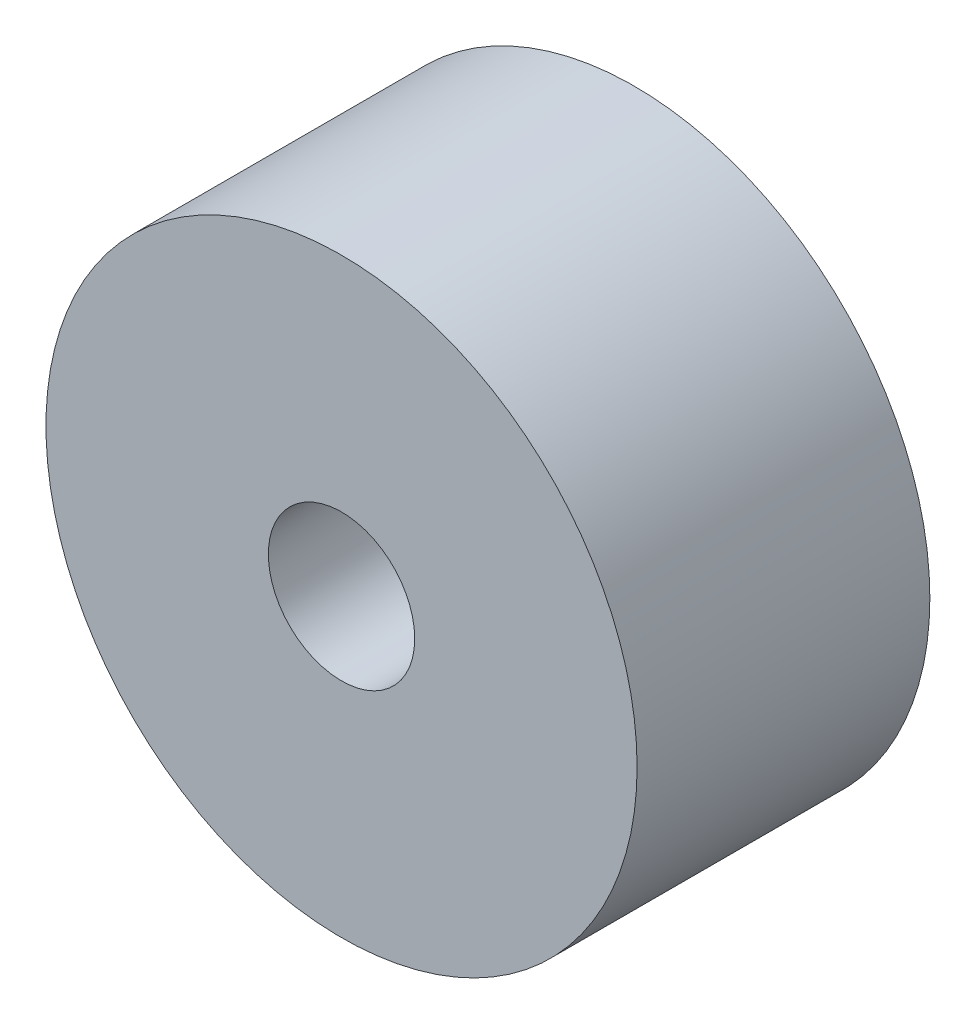
ISO-10303-21;
HEADER;
FILE_DESCRIPTION(('STEP AP214'),'2;1');
FILE_NAME('part.step','',(''),(''),'','','');
FILE_SCHEMA(('AUTOMOTIVE_DESIGN { 1 0 10303 214 1 1 1 1 }'));
ENDSEC;
DATA;
#1=APPLICATION_CONTEXT('core data for automotive mechanical design processes');
#2=APPLICATION_PROTOCOL_DEFINITION('international standard','automotive_design',2000,#1);
#3=PRODUCT_CONTEXT('',#1,'mechanical');
#4=PRODUCT('Part','Part','',(#3));
#5=PRODUCT_RELATED_PRODUCT_CATEGORY('part','',(#4));
#6=PRODUCT_DEFINITION_FORMATION('','',#4);
#7=PRODUCT_DEFINITION_CONTEXT('part definition',#1,'design');
#8=PRODUCT_DEFINITION('design','',#6,#7);
#9=PRODUCT_DEFINITION_SHAPE('','',#8);
#10=(LENGTH_UNIT() NAMED_UNIT(*) SI_UNIT(.MILLI.,.METRE.));
#11=(NAMED_UNIT(*) PLANE_ANGLE_UNIT() SI_UNIT($,.RADIAN.));
#12=(NAMED_UNIT(*) SI_UNIT($,.STERADIAN.) SOLID_ANGLE_UNIT());
#13=UNCERTAINTY_MEASURE_WITH_UNIT(LENGTH_MEASURE(1.E-05),#10,'distance_accuracy_value','');
#14=(GEOMETRIC_REPRESENTATION_CONTEXT(3) GLOBAL_UNCERTAINTY_ASSIGNED_CONTEXT((#13)) GLOBAL_UNIT_ASSIGNED_CONTEXT((#10,
#11,#12)) REPRESENTATION_CONTEXT('',''));
#15=CARTESIAN_POINT('',(0.,0.,0.));
#16=DIRECTION('',(0.,0.,1.));
#17=DIRECTION('',(1.,0.,0.));
#18=AXIS2_PLACEMENT_3D('',#15,#16,#17);
#19=CARTESIAN_POINT('',(0.,0.,20.));
#20=DIRECTION('',(0.,0.,1.));
#21=DIRECTION('',(1.,0.,0.));
#22=AXIS2_PLACEMENT_3D('',#19,#20,#21);
#23=PLANE('',#22);
#24=CARTESIAN_POINT('',(0.,0.,20.));
#25=DIRECTION('',(0.,0.,1.));
#26=DIRECTION('',(1.,0.,0.));
#27=AXIS2_PLACEMENT_3D('',#24,#25,#26);
#28=CIRCLE('',#27,40.3846153846154);
#29=CARTESIAN_POINT('',(40.3846153846154,0.,20.));
#30=VERTEX_POINT('',#29);
#31=EDGE_CURVE('E10',#30,#30,#28,.T.);
#32=ORIENTED_EDGE('',*,*,#31,.T.);
#33=EDGE_LOOP('',(#32));
#34=FACE_BOUND('',#33,.T.);
#35=CARTESIAN_POINT('',(0.,0.,20.));
#36=DIRECTION('',(0.,0.,1.));
#37=DIRECTION('',(1.,0.,0.));
#38=AXIS2_PLACEMENT_3D('',#35,#36,#37);
#39=CIRCLE('',#38,10.);
#40=CARTESIAN_POINT('',(10.,0.,20.));
#41=VERTEX_POINT('',#40);
#42=EDGE_CURVE('E46',#41,#41,#39,.T.);
#43=ORIENTED_EDGE('',*,*,#42,.F.);
#44=EDGE_LOOP('',(#43));
#45=FACE_BOUND('',#44,.T.);
#46=ADVANCED_FACE('F35',(#34,#45),#23,.T.);
#47=CARTESIAN_POINT('',(0.,0.,-20.));
#48=DIRECTION('',(0.,0.,1.));
#49=DIRECTION('',(1.,0.,0.));
#50=AXIS2_PLACEMENT_3D('',#47,#48,#49);
#51=PLANE('',#50);
#52=CARTESIAN_POINT('',(0.,0.,-20.));
#53=DIRECTION('',(0.,0.,1.));
#54=DIRECTION('',(1.,0.,0.));
#55=AXIS2_PLACEMENT_3D('',#52,#53,#54);
#56=CIRCLE('',#55,40.3846153846154);
#57=CARTESIAN_POINT('',(40.3846153846154,0.,-20.));
#58=VERTEX_POINT('',#57);
#59=EDGE_CURVE('E39',#58,#58,#56,.T.);
#60=ORIENTED_EDGE('',*,*,#59,.F.);
#61=EDGE_LOOP('',(#60));
#62=FACE_BOUND('',#61,.T.);
#63=CARTESIAN_POINT('',(0.,0.,-20.));
#64=DIRECTION('',(0.,0.,1.));
#65=DIRECTION('',(1.,0.,0.));
#66=AXIS2_PLACEMENT_3D('',#63,#64,#65);
#67=CIRCLE('',#66,10.);
#68=CARTESIAN_POINT('',(10.,0.,-20.));
#69=VERTEX_POINT('',#68);
#70=EDGE_CURVE('E48',#69,#69,#67,.T.);
#71=ORIENTED_EDGE('',*,*,#70,.T.);
#72=EDGE_LOOP('',(#71));
#73=FACE_BOUND('',#72,.T.);
#74=ADVANCED_FACE('F58',(#62,#73),#51,.F.);
#75=CARTESIAN_POINT('',(0.,0.,20.));
#76=DIRECTION('',(0.,0.,-1.));
#77=DIRECTION('',(-1.,0.,0.));
#78=AXIS2_PLACEMENT_3D('',#75,#76,#77);
#79=CYLINDRICAL_SURFACE('',#78,40.3846153846154);
#80=ORIENTED_EDGE('',*,*,#31,.F.);
#81=EDGE_LOOP('',(#80));
#82=FACE_BOUND('',#81,.T.);
#83=ORIENTED_EDGE('',*,*,#59,.T.);
#84=EDGE_LOOP('',(#83));
#85=FACE_BOUND('',#84,.T.);
#86=ADVANCED_FACE('F37',(#82,#85),#79,.T.);
#87=CARTESIAN_POINT('',(0.,0.,20.));
#88=DIRECTION('',(0.,0.,-1.));
#89=DIRECTION('',(-1.,0.,0.));
#90=AXIS2_PLACEMENT_3D('',#87,#88,#89);
#91=CYLINDRICAL_SURFACE('',#90,10.);
#92=ORIENTED_EDGE('',*,*,#42,.T.);
#93=EDGE_LOOP('',(#92));
#94=FACE_BOUND('',#93,.T.);
#95=ORIENTED_EDGE('',*,*,#70,.F.);
#96=EDGE_LOOP('',(#95));
#97=FACE_BOUND('',#96,.T.);
#98=ADVANCED_FACE('F54',(#94,#97),#91,.F.);
#99=CLOSED_SHELL('',(#46,#74,#86,#98));
#100=MANIFOLD_SOLID_BREP('B2',#99);
#101=ADVANCED_BREP_SHAPE_REPRESENTATION('',(#18,#100),#14);
#102=SHAPE_DEFINITION_REPRESENTATION(#9,#101);
ENDSEC;
END-ISO-10303-21;
